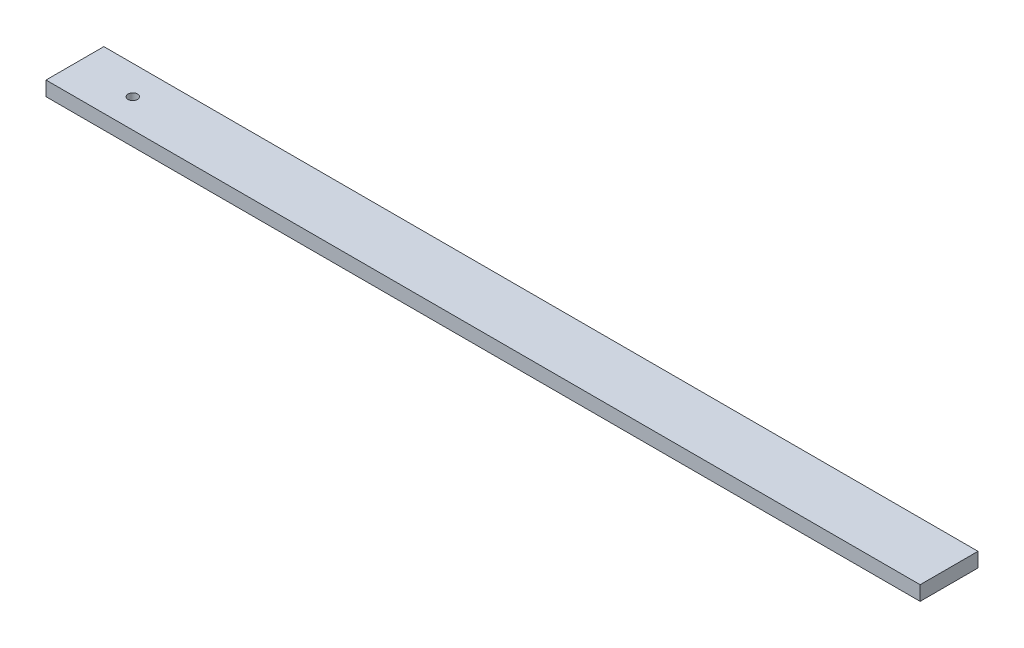
ISO-10303-21;
HEADER;
FILE_DESCRIPTION(('STEP AP214'),'2;1');
FILE_NAME('part.step','',(''),(''),'','','');
FILE_SCHEMA(('AUTOMOTIVE_DESIGN { 1 0 10303 214 1 1 1 1 }'));
ENDSEC;
DATA;
#1=APPLICATION_CONTEXT('core data for automotive mechanical design processes');
#2=APPLICATION_PROTOCOL_DEFINITION('international standard','automotive_design',2000,#1);
#3=PRODUCT_CONTEXT('',#1,'mechanical');
#4=PRODUCT('Part','Part','',(#3));
#5=PRODUCT_RELATED_PRODUCT_CATEGORY('part','',(#4));
#6=PRODUCT_DEFINITION_FORMATION('','',#4);
#7=PRODUCT_DEFINITION_CONTEXT('part definition',#1,'design');
#8=PRODUCT_DEFINITION('design','',#6,#7);
#9=PRODUCT_DEFINITION_SHAPE('','',#8);
#10=(LENGTH_UNIT() NAMED_UNIT(*) SI_UNIT(.MILLI.,.METRE.));
#11=(NAMED_UNIT(*) PLANE_ANGLE_UNIT() SI_UNIT($,.RADIAN.));
#12=(NAMED_UNIT(*) SI_UNIT($,.STERADIAN.) SOLID_ANGLE_UNIT());
#13=UNCERTAINTY_MEASURE_WITH_UNIT(LENGTH_MEASURE(1.E-05),#10,'distance_accuracy_value','');
#14=(GEOMETRIC_REPRESENTATION_CONTEXT(3) GLOBAL_UNCERTAINTY_ASSIGNED_CONTEXT((#13)) GLOBAL_UNIT_ASSIGNED_CONTEXT((#10,
#11,#12)) REPRESENTATION_CONTEXT('',''));
#15=CARTESIAN_POINT('',(0.,0.,0.));
#16=DIRECTION('',(0.,0.,1.));
#17=DIRECTION('',(1.,0.,0.));
#18=AXIS2_PLACEMENT_3D('',#15,#16,#17);
#19=CARTESIAN_POINT('',(0.,6.35,0.));
#20=DIRECTION('',(0.,0.,-1.));
#21=DIRECTION('',(-1.,0.,0.));
#22=AXIS2_PLACEMENT_3D('',#19,#20,#21);
#23=PLANE('',#22);
#24=DIRECTION('',(1.,0.,0.));
#25=VECTOR('',#24,1.);
#26=CARTESIAN_POINT('',(0.,0.,0.));
#27=LINE('',#26,#25);
#28=CARTESIAN_POINT('',(0.,0.,0.));
#29=VERTEX_POINT('',#28);
#30=CARTESIAN_POINT('',(383.75,0.,0.));
#31=VERTEX_POINT('',#30);
#32=EDGE_CURVE('E109',#29,#31,#27,.T.);
#33=ORIENTED_EDGE('',*,*,#32,.T.);
#34=DIRECTION('',(0.,-1.,0.));
#35=VECTOR('',#34,1.);
#36=CARTESIAN_POINT('',(383.75,6.35,0.));
#37=LINE('',#36,#35);
#38=CARTESIAN_POINT('',(383.75,6.35,0.));
#39=VERTEX_POINT('',#38);
#40=EDGE_CURVE('E11',#39,#31,#37,.T.);
#41=ORIENTED_EDGE('',*,*,#40,.F.);
#42=DIRECTION('',(1.,0.,0.));
#43=VECTOR('',#42,1.);
#44=CARTESIAN_POINT('',(0.,6.35,0.));
#45=LINE('',#44,#43);
#46=CARTESIAN_POINT('',(0.,6.35,0.));
#47=VERTEX_POINT('',#46);
#48=EDGE_CURVE('E91',#47,#39,#45,.T.);
#49=ORIENTED_EDGE('',*,*,#48,.F.);
#50=DIRECTION('',(0.,-1.,0.));
#51=VECTOR('',#50,1.);
#52=CARTESIAN_POINT('',(0.,6.35,0.));
#53=LINE('',#52,#51);
#54=EDGE_CURVE('E58',#47,#29,#53,.T.);
#55=ORIENTED_EDGE('',*,*,#54,.T.);
#56=EDGE_LOOP('',(#33,#41,#49,#55));
#57=FACE_BOUND('',#56,.T.);
#58=ADVANCED_FACE('F41',(#57),#23,.F.);
#59=CARTESIAN_POINT('',(383.75,6.35,0.));
#60=DIRECTION('',(-1.,0.,0.));
#61=DIRECTION('',(0.,0.,1.));
#62=AXIS2_PLACEMENT_3D('',#59,#60,#61);
#63=PLANE('',#62);
#64=DIRECTION('',(0.,0.,-1.));
#65=VECTOR('',#64,1.);
#66=CARTESIAN_POINT('',(383.75,0.,0.));
#67=LINE('',#66,#65);
#68=CARTESIAN_POINT('',(383.75,0.,-25.4));
#69=VERTEX_POINT('',#68);
#70=EDGE_CURVE('E97',#31,#69,#67,.T.);
#71=ORIENTED_EDGE('',*,*,#70,.T.);
#72=DIRECTION('',(0.,-1.,0.));
#73=VECTOR('',#72,1.);
#74=CARTESIAN_POINT('',(383.75,6.35,-25.4));
#75=LINE('',#74,#73);
#76=CARTESIAN_POINT('',(383.75,6.35,-25.4));
#77=VERTEX_POINT('',#76);
#78=EDGE_CURVE('E50',#77,#69,#75,.T.);
#79=ORIENTED_EDGE('',*,*,#78,.F.);
#80=DIRECTION('',(0.,0.,-1.));
#81=VECTOR('',#80,1.);
#82=CARTESIAN_POINT('',(383.75,6.35,0.));
#83=LINE('',#82,#81);
#84=EDGE_CURVE('E83',#39,#77,#83,.T.);
#85=ORIENTED_EDGE('',*,*,#84,.F.);
#86=ORIENTED_EDGE('',*,*,#40,.T.);
#87=EDGE_LOOP('',(#71,#79,#85,#86));
#88=FACE_BOUND('',#87,.T.);
#89=ADVANCED_FACE('F96',(#88),#63,.F.);
#90=CARTESIAN_POINT('',(0.,6.35,-25.4));
#91=DIRECTION('',(0.,0.,-1.));
#92=DIRECTION('',(-1.,0.,0.));
#93=AXIS2_PLACEMENT_3D('',#90,#91,#92);
#94=PLANE('',#93);
#95=DIRECTION('',(1.,0.,0.));
#96=VECTOR('',#95,1.);
#97=CARTESIAN_POINT('',(0.,0.,-25.4));
#98=LINE('',#97,#96);
#99=CARTESIAN_POINT('',(0.,0.,-25.4));
#100=VERTEX_POINT('',#99);
#101=EDGE_CURVE('E115',#100,#69,#98,.T.);
#102=ORIENTED_EDGE('',*,*,#101,.F.);
#103=DIRECTION('',(0.,-1.,0.));
#104=VECTOR('',#103,1.);
#105=CARTESIAN_POINT('',(0.,6.35,-25.4));
#106=LINE('',#105,#104);
#107=CARTESIAN_POINT('',(0.,6.35,-25.4));
#108=VERTEX_POINT('',#107);
#109=EDGE_CURVE('E72',#108,#100,#106,.T.);
#110=ORIENTED_EDGE('',*,*,#109,.F.);
#111=DIRECTION('',(1.,0.,0.));
#112=VECTOR('',#111,1.);
#113=CARTESIAN_POINT('',(0.,6.35,-25.4));
#114=LINE('',#113,#112);
#115=EDGE_CURVE('E90',#108,#77,#114,.T.);
#116=ORIENTED_EDGE('',*,*,#115,.T.);
#117=ORIENTED_EDGE('',*,*,#78,.T.);
#118=EDGE_LOOP('',(#102,#110,#116,#117));
#119=FACE_BOUND('',#118,.T.);
#120=ADVANCED_FACE('F101',(#119),#94,.T.);
#121=CARTESIAN_POINT('',(0.,6.35,0.));
#122=DIRECTION('',(-1.,0.,0.));
#123=DIRECTION('',(0.,0.,1.));
#124=AXIS2_PLACEMENT_3D('',#121,#122,#123);
#125=PLANE('',#124);
#126=DIRECTION('',(0.,0.,-1.));
#127=VECTOR('',#126,1.);
#128=CARTESIAN_POINT('',(0.,0.,0.));
#129=LINE('',#128,#127);
#130=EDGE_CURVE('E118',#29,#100,#129,.T.);
#131=ORIENTED_EDGE('',*,*,#130,.F.);
#132=ORIENTED_EDGE('',*,*,#54,.F.);
#133=DIRECTION('',(0.,0.,-1.));
#134=VECTOR('',#133,1.);
#135=CARTESIAN_POINT('',(0.,6.35,0.));
#136=LINE('',#135,#134);
#137=EDGE_CURVE('E103',#47,#108,#136,.T.);
#138=ORIENTED_EDGE('',*,*,#137,.T.);
#139=ORIENTED_EDGE('',*,*,#109,.T.);
#140=EDGE_LOOP('',(#131,#132,#138,#139));
#141=FACE_BOUND('',#140,.T.);
#142=ADVANCED_FACE('F145',(#141),#125,.T.);
#143=CARTESIAN_POINT('',(0.,6.35,0.));
#144=DIRECTION('',(0.,1.,0.));
#145=DIRECTION('',(0.,0.,1.));
#146=AXIS2_PLACEMENT_3D('',#143,#144,#145);
#147=PLANE('',#146);
#148=CARTESIAN_POINT('',(25.4,6.35,-12.7));
#149=DIRECTION('',(0.,1.,0.));
#150=DIRECTION('',(0.,0.,1.));
#151=AXIS2_PLACEMENT_3D('',#148,#149,#150);
#152=CIRCLE('',#151,2.0828);
#153=CARTESIAN_POINT('',(25.4,6.35,-10.6172));
#154=VERTEX_POINT('',#153);
#155=EDGE_CURVE('E128',#154,#154,#152,.T.);
#156=ORIENTED_EDGE('',*,*,#155,.F.);
#157=EDGE_LOOP('',(#156));
#158=FACE_BOUND('',#157,.T.);
#159=ORIENTED_EDGE('',*,*,#48,.T.);
#160=ORIENTED_EDGE('',*,*,#84,.T.);
#161=ORIENTED_EDGE('',*,*,#115,.F.);
#162=ORIENTED_EDGE('',*,*,#137,.F.);
#163=EDGE_LOOP('',(#159,#160,#161,#162));
#164=FACE_BOUND('',#163,.T.);
#165=ADVANCED_FACE('F87',(#158,#164),#147,.T.);
#166=CARTESIAN_POINT('',(0.,0.,0.));
#167=DIRECTION('',(0.,1.,0.));
#168=DIRECTION('',(0.,0.,1.));
#169=AXIS2_PLACEMENT_3D('',#166,#167,#168);
#170=PLANE('',#169);
#171=CARTESIAN_POINT('',(25.4,0.,-12.7));
#172=DIRECTION('',(0.,1.,0.));
#173=DIRECTION('',(0.,0.,1.));
#174=AXIS2_PLACEMENT_3D('',#171,#172,#173);
#175=CIRCLE('',#174,2.0828);
#176=CARTESIAN_POINT('',(25.4,0.,-10.6172));
#177=VERTEX_POINT('',#176);
#178=EDGE_CURVE('E112',#177,#177,#175,.T.);
#179=ORIENTED_EDGE('',*,*,#178,.T.);
#180=EDGE_LOOP('',(#179));
#181=FACE_BOUND('',#180,.T.);
#182=ORIENTED_EDGE('',*,*,#32,.F.);
#183=ORIENTED_EDGE('',*,*,#130,.T.);
#184=ORIENTED_EDGE('',*,*,#101,.T.);
#185=ORIENTED_EDGE('',*,*,#70,.F.);
#186=EDGE_LOOP('',(#182,#183,#184,#185));
#187=FACE_BOUND('',#186,.T.);
#188=ADVANCED_FACE('F136',(#181,#187),#170,.F.);
#189=CARTESIAN_POINT('',(25.4,0.,-12.7));
#190=DIRECTION('',(0.,1.,0.));
#191=DIRECTION('',(0.,0.,1.));
#192=AXIS2_PLACEMENT_3D('',#189,#190,#191);
#193=CYLINDRICAL_SURFACE('',#192,2.0828);
#194=ORIENTED_EDGE('',*,*,#178,.F.);
#195=EDGE_LOOP('',(#194));
#196=FACE_BOUND('',#195,.T.);
#197=ORIENTED_EDGE('',*,*,#155,.T.);
#198=EDGE_LOOP('',(#197));
#199=FACE_BOUND('',#198,.T.);
#200=ADVANCED_FACE('F138',(#196,#199),#193,.F.);
#201=CLOSED_SHELL('',(#58,#89,#120,#142,#165,#188,#200));
#202=MANIFOLD_SOLID_BREP('B2',#201);
#203=ADVANCED_BREP_SHAPE_REPRESENTATION('',(#18,#202),#14);
#204=SHAPE_DEFINITION_REPRESENTATION(#9,#203);
ENDSEC;
END-ISO-10303-21;
